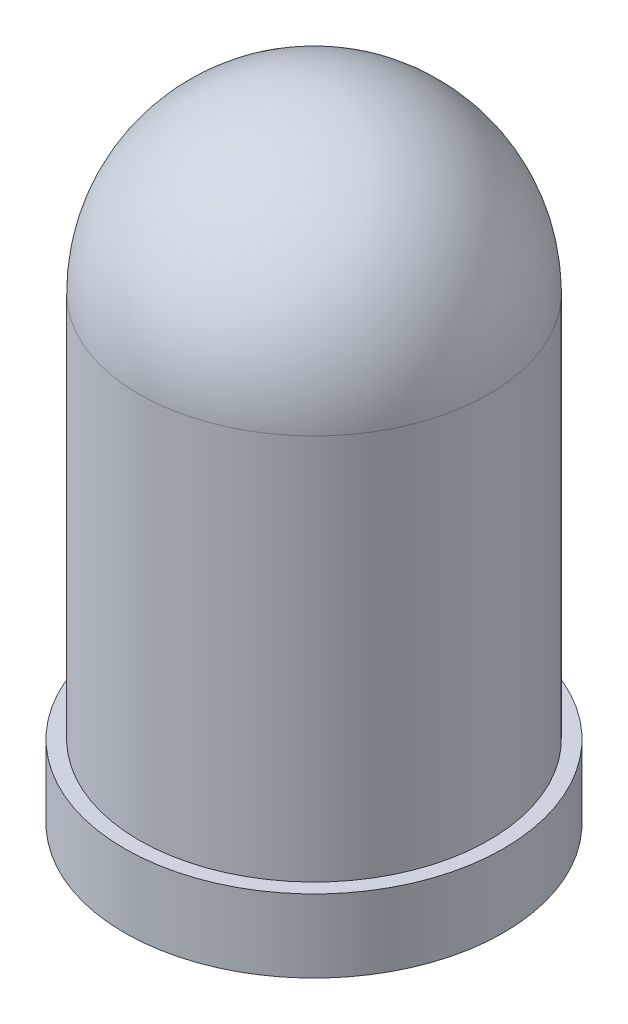
ISO-10303-21;
HEADER;
FILE_DESCRIPTION(('STEP AP214'),'2;1');
FILE_NAME('part.step','',(''),(''),'','','');
FILE_SCHEMA(('AUTOMOTIVE_DESIGN { 1 0 10303 214 1 1 1 1 }'));
ENDSEC;
DATA;
#1=APPLICATION_CONTEXT('core data for automotive mechanical design processes');
#2=APPLICATION_PROTOCOL_DEFINITION('international standard','automotive_design',2000,#1);
#3=PRODUCT_CONTEXT('',#1,'mechanical');
#4=PRODUCT('Part','Part','',(#3));
#5=PRODUCT_RELATED_PRODUCT_CATEGORY('part','',(#4));
#6=PRODUCT_DEFINITION_FORMATION('','',#4);
#7=PRODUCT_DEFINITION_CONTEXT('part definition',#1,'design');
#8=PRODUCT_DEFINITION('design','',#6,#7);
#9=PRODUCT_DEFINITION_SHAPE('','',#8);
#10=(LENGTH_UNIT() NAMED_UNIT(*) SI_UNIT(.MILLI.,.METRE.));
#11=(NAMED_UNIT(*) PLANE_ANGLE_UNIT() SI_UNIT($,.RADIAN.));
#12=(NAMED_UNIT(*) SI_UNIT($,.STERADIAN.) SOLID_ANGLE_UNIT());
#13=UNCERTAINTY_MEASURE_WITH_UNIT(LENGTH_MEASURE(1.E-05),#10,'distance_accuracy_value','');
#14=(GEOMETRIC_REPRESENTATION_CONTEXT(3) GLOBAL_UNCERTAINTY_ASSIGNED_CONTEXT((#13)) GLOBAL_UNIT_ASSIGNED_CONTEXT((#10,
#11,#12)) REPRESENTATION_CONTEXT('',''));
#15=CARTESIAN_POINT('',(0.,0.,0.));
#16=DIRECTION('',(0.,0.,1.));
#17=DIRECTION('',(1.,0.,0.));
#18=AXIS2_PLACEMENT_3D('',#15,#16,#17);
#19=CARTESIAN_POINT('',(0.,8.7,0.));
#20=DIRECTION('',(0.,-1.,0.));
#21=DIRECTION('',(0.,0.,-1.));
#22=AXIS2_PLACEMENT_3D('',#19,#20,#21);
#23=CYLINDRICAL_SURFACE('',#22,2.4);
#24=CARTESIAN_POINT('',(0.,1.,0.));
#25=DIRECTION('',(0.,1.,0.));
#26=DIRECTION('',(0.,0.,1.));
#27=AXIS2_PLACEMENT_3D('',#24,#25,#26);
#28=CIRCLE('',#27,2.4);
#29=CARTESIAN_POINT('',(0.,1.,2.4));
#30=VERTEX_POINT('',#29);
#31=EDGE_CURVE('E43',#30,#30,#28,.T.);
#32=ORIENTED_EDGE('',*,*,#31,.T.);
#33=EDGE_LOOP('',(#32));
#34=FACE_BOUND('',#33,.T.);
#35=CARTESIAN_POINT('',(0.,6.3,0.));
#36=DIRECTION('',(0.,-1.,0.));
#37=DIRECTION('',(0.,0.,-1.));
#38=AXIS2_PLACEMENT_3D('',#35,#36,#37);
#39=CIRCLE('',#38,2.4);
#40=CARTESIAN_POINT('',(0.,6.3,-2.4));
#41=VERTEX_POINT('',#40);
#42=EDGE_CURVE('E10',#41,#41,#39,.T.);
#43=ORIENTED_EDGE('',*,*,#42,.T.);
#44=EDGE_LOOP('',(#43));
#45=FACE_BOUND('',#44,.T.);
#46=ADVANCED_FACE('F39',(#34,#45),#23,.T.);
#47=CARTESIAN_POINT('',(0.,6.3,0.));
#48=DIRECTION('',(0.,1.,0.));
#49=DIRECTION('',(0.,0.,1.));
#50=AXIS2_PLACEMENT_3D('',#47,#48,#49);
#51=SPHERICAL_SURFACE('',#50,2.4);
#52=ORIENTED_EDGE('',*,*,#42,.F.);
#53=EDGE_LOOP('',(#52));
#54=FACE_BOUND('',#53,.T.);
#55=ADVANCED_FACE('F41',(#54),#51,.T.);
#56=CARTESIAN_POINT('',(0.,1.,0.));
#57=DIRECTION('',(0.,-1.,0.));
#58=DIRECTION('',(0.,0.,-1.));
#59=AXIS2_PLACEMENT_3D('',#56,#57,#58);
#60=CYLINDRICAL_SURFACE('',#59,2.6);
#61=CARTESIAN_POINT('',(0.,1.,0.));
#62=DIRECTION('',(0.,1.,0.));
#63=DIRECTION('',(0.,0.,1.));
#64=AXIS2_PLACEMENT_3D('',#61,#62,#63);
#65=CIRCLE('',#64,2.6);
#66=CARTESIAN_POINT('',(0.,1.,2.6));
#67=VERTEX_POINT('',#66);
#68=EDGE_CURVE('E50',#67,#67,#65,.T.);
#69=ORIENTED_EDGE('',*,*,#68,.F.);
#70=EDGE_LOOP('',(#69));
#71=FACE_BOUND('',#70,.T.);
#72=CARTESIAN_POINT('',(0.,0.,0.));
#73=DIRECTION('',(0.,1.,0.));
#74=DIRECTION('',(0.,0.,1.));
#75=AXIS2_PLACEMENT_3D('',#72,#73,#74);
#76=CIRCLE('',#75,2.6);
#77=CARTESIAN_POINT('',(0.,0.,2.6));
#78=VERTEX_POINT('',#77);
#79=EDGE_CURVE('E52',#78,#78,#76,.T.);
#80=ORIENTED_EDGE('',*,*,#79,.T.);
#81=EDGE_LOOP('',(#80));
#82=FACE_BOUND('',#81,.T.);
#83=ADVANCED_FACE('F60',(#71,#82),#60,.T.);
#84=CARTESIAN_POINT('',(0.,1.,0.));
#85=DIRECTION('',(0.,1.,0.));
#86=DIRECTION('',(0.,0.,1.));
#87=AXIS2_PLACEMENT_3D('',#84,#85,#86);
#88=PLANE('',#87);
#89=ORIENTED_EDGE('',*,*,#31,.F.);
#90=EDGE_LOOP('',(#89));
#91=FACE_BOUND('',#90,.T.);
#92=ORIENTED_EDGE('',*,*,#68,.T.);
#93=EDGE_LOOP('',(#92));
#94=FACE_BOUND('',#93,.T.);
#95=ADVANCED_FACE('F58',(#91,#94),#88,.T.);
#96=CARTESIAN_POINT('',(0.,0.,0.));
#97=DIRECTION('',(0.,1.,0.));
#98=DIRECTION('',(0.,0.,1.));
#99=AXIS2_PLACEMENT_3D('',#96,#97,#98);
#100=PLANE('',#99);
#101=ORIENTED_EDGE('',*,*,#79,.F.);
#102=EDGE_LOOP('',(#101));
#103=FACE_BOUND('',#102,.T.);
#104=ADVANCED_FACE('F66',(#103),#100,.F.);
#105=CLOSED_SHELL('',(#46,#55,#83,#95,#104));
#106=MANIFOLD_SOLID_BREP('B2',#105);
#107=ADVANCED_BREP_SHAPE_REPRESENTATION('',(#18,#106),#14);
#108=SHAPE_DEFINITION_REPRESENTATION(#9,#107);
ENDSEC;
END-ISO-10303-21;
